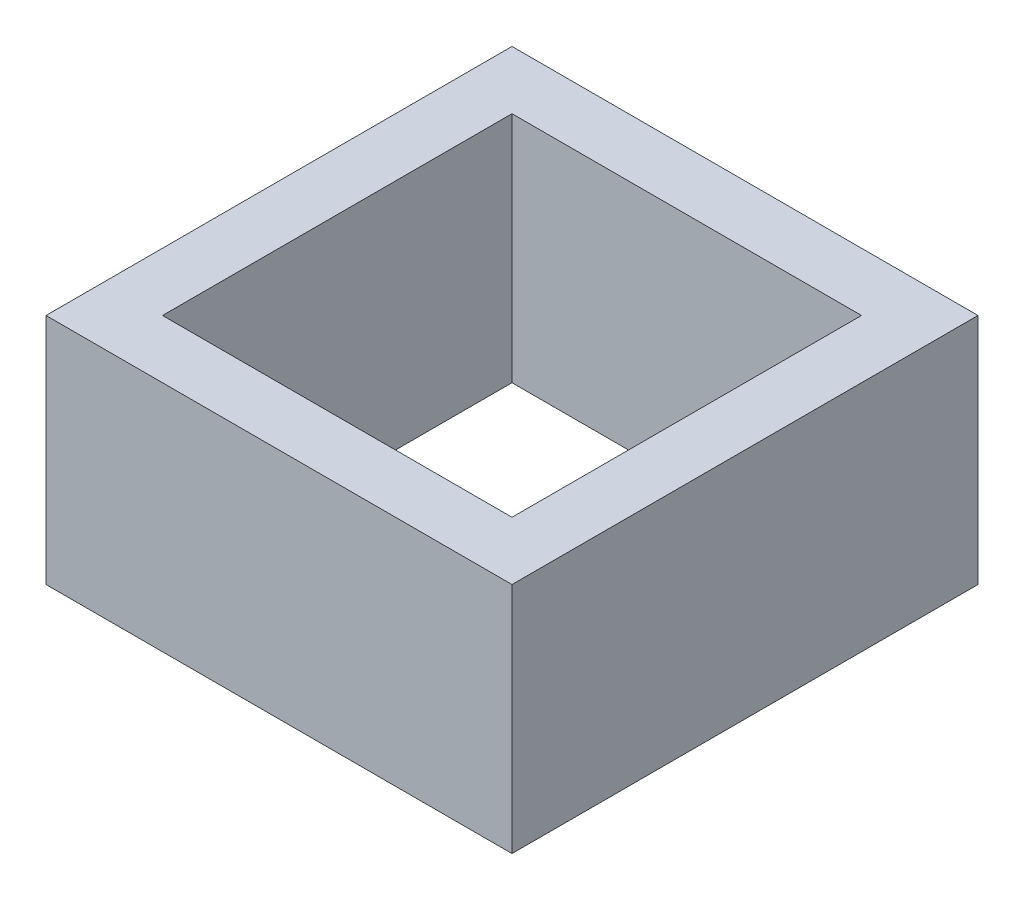
ISO-10303-21;
HEADER;
FILE_DESCRIPTION(('STEP AP214'),'2;1');
FILE_NAME('part.step','',(''),(''),'','','');
FILE_SCHEMA(('AUTOMOTIVE_DESIGN { 1 0 10303 214 1 1 1 1 }'));
ENDSEC;
DATA;
#1=APPLICATION_CONTEXT('core data for automotive mechanical design processes');
#2=APPLICATION_PROTOCOL_DEFINITION('international standard','automotive_design',2000,#1);
#3=PRODUCT_CONTEXT('',#1,'mechanical');
#4=PRODUCT('Part','Part','',(#3));
#5=PRODUCT_RELATED_PRODUCT_CATEGORY('part','',(#4));
#6=PRODUCT_DEFINITION_FORMATION('','',#4);
#7=PRODUCT_DEFINITION_CONTEXT('part definition',#1,'design');
#8=PRODUCT_DEFINITION('design','',#6,#7);
#9=PRODUCT_DEFINITION_SHAPE('','',#8);
#10=(LENGTH_UNIT() NAMED_UNIT(*) SI_UNIT(.MILLI.,.METRE.));
#11=(NAMED_UNIT(*) PLANE_ANGLE_UNIT() SI_UNIT($,.RADIAN.));
#12=(NAMED_UNIT(*) SI_UNIT($,.STERADIAN.) SOLID_ANGLE_UNIT());
#13=UNCERTAINTY_MEASURE_WITH_UNIT(LENGTH_MEASURE(1.E-05),#10,'distance_accuracy_value','');
#14=(GEOMETRIC_REPRESENTATION_CONTEXT(3) GLOBAL_UNCERTAINTY_ASSIGNED_CONTEXT((#13)) GLOBAL_UNIT_ASSIGNED_CONTEXT((#10,
#11,#12)) REPRESENTATION_CONTEXT('',''));
#15=CARTESIAN_POINT('',(0.,0.,0.));
#16=DIRECTION('',(0.,0.,1.));
#17=DIRECTION('',(1.,0.,0.));
#18=AXIS2_PLACEMENT_3D('',#15,#16,#17);
#19=CARTESIAN_POINT('',(0.,12.7,0.));
#20=DIRECTION('',(0.,1.,0.));
#21=DIRECTION('',(0.,0.,1.));
#22=AXIS2_PLACEMENT_3D('',#19,#20,#21);
#23=PLANE('',#22);
#24=DIRECTION('',(0.,0.,-1.));
#25=VECTOR('',#24,1.);
#26=CARTESIAN_POINT('',(12.7,12.7,12.7));
#27=LINE('',#26,#25);
#28=CARTESIAN_POINT('',(12.7,12.7,12.7));
#29=VERTEX_POINT('',#28);
#30=CARTESIAN_POINT('',(12.7,12.7,-12.7));
#31=VERTEX_POINT('',#30);
#32=EDGE_CURVE('E177',#29,#31,#27,.T.);
#33=ORIENTED_EDGE('',*,*,#32,.T.);
#34=DIRECTION('',(-1.,0.,0.));
#35=VECTOR('',#34,1.);
#36=CARTESIAN_POINT('',(-12.7,12.7,-12.7));
#37=LINE('',#36,#35);
#38=CARTESIAN_POINT('',(-12.7,12.7,-12.7));
#39=VERTEX_POINT('',#38);
#40=EDGE_CURVE('E181',#31,#39,#37,.T.);
#41=ORIENTED_EDGE('',*,*,#40,.T.);
#42=DIRECTION('',(0.,0.,1.));
#43=VECTOR('',#42,1.);
#44=CARTESIAN_POINT('',(-12.7,12.7,12.7));
#45=LINE('',#44,#43);
#46=CARTESIAN_POINT('',(-12.7,12.7,12.7));
#47=VERTEX_POINT('',#46);
#48=EDGE_CURVE('E185',#39,#47,#45,.T.);
#49=ORIENTED_EDGE('',*,*,#48,.T.);
#50=DIRECTION('',(1.,0.,0.));
#51=VECTOR('',#50,1.);
#52=CARTESIAN_POINT('',(-12.7,12.7,12.7));
#53=LINE('',#52,#51);
#54=EDGE_CURVE('E188',#47,#29,#53,.T.);
#55=ORIENTED_EDGE('',*,*,#54,.T.);
#56=EDGE_LOOP('',(#33,#41,#49,#55));
#57=FACE_BOUND('',#56,.T.);
#58=DIRECTION('',(-1.,0.,0.));
#59=VECTOR('',#58,1.);
#60=CARTESIAN_POINT('',(0.,12.7,-9.525));
#61=LINE('',#60,#59);
#62=CARTESIAN_POINT('',(9.52500000000001,12.7,-9.525));
#63=VERTEX_POINT('',#62);
#64=CARTESIAN_POINT('',(-9.525,12.7,-9.525));
#65=VERTEX_POINT('',#64);
#66=EDGE_CURVE('E138',#63,#65,#61,.T.);
#67=ORIENTED_EDGE('',*,*,#66,.F.);
#68=DIRECTION('',(0.,0.,-1.));
#69=VECTOR('',#68,1.);
#70=CARTESIAN_POINT('',(9.52500000000001,12.7,0.));
#71=LINE('',#70,#69);
#72=CARTESIAN_POINT('',(9.52500000000001,12.7,9.525));
#73=VERTEX_POINT('',#72);
#74=EDGE_CURVE('E129',#73,#63,#71,.T.);
#75=ORIENTED_EDGE('',*,*,#74,.F.);
#76=DIRECTION('',(1.,0.,0.));
#77=VECTOR('',#76,1.);
#78=CARTESIAN_POINT('',(0.,12.7,9.525));
#79=LINE('',#78,#77);
#80=CARTESIAN_POINT('',(-9.525,12.7,9.525));
#81=VERTEX_POINT('',#80);
#82=EDGE_CURVE('E155',#81,#73,#79,.T.);
#83=ORIENTED_EDGE('',*,*,#82,.F.);
#84=DIRECTION('',(0.,0.,1.));
#85=VECTOR('',#84,1.);
#86=CARTESIAN_POINT('',(-9.525,12.7,0.));
#87=LINE('',#86,#85);
#88=EDGE_CURVE('E151',#65,#81,#87,.T.);
#89=ORIENTED_EDGE('',*,*,#88,.F.);
#90=EDGE_LOOP('',(#67,#75,#83,#89));
#91=FACE_BOUND('',#90,.T.);
#92=ADVANCED_FACE('F63',(#57,#91),#23,.T.);
#93=CARTESIAN_POINT('',(0.,0.,0.));
#94=DIRECTION('',(0.,1.,0.));
#95=DIRECTION('',(0.,0.,1.));
#96=AXIS2_PLACEMENT_3D('',#93,#94,#95);
#97=PLANE('',#96);
#98=DIRECTION('',(0.,0.,-1.));
#99=VECTOR('',#98,1.);
#100=CARTESIAN_POINT('',(12.7,0.,12.7));
#101=LINE('',#100,#99);
#102=CARTESIAN_POINT('',(12.7,0.,12.7));
#103=VERTEX_POINT('',#102);
#104=CARTESIAN_POINT('',(12.7,0.,-12.7));
#105=VERTEX_POINT('',#104);
#106=EDGE_CURVE('E147',#103,#105,#101,.T.);
#107=ORIENTED_EDGE('',*,*,#106,.F.);
#108=DIRECTION('',(1.,0.,0.));
#109=VECTOR('',#108,1.);
#110=CARTESIAN_POINT('',(-12.7,0.,12.7));
#111=LINE('',#110,#109);
#112=CARTESIAN_POINT('',(-12.7,0.,12.7));
#113=VERTEX_POINT('',#112);
#114=EDGE_CURVE('E182',#113,#103,#111,.T.);
#115=ORIENTED_EDGE('',*,*,#114,.F.);
#116=DIRECTION('',(0.,0.,1.));
#117=VECTOR('',#116,1.);
#118=CARTESIAN_POINT('',(-12.7,0.,12.7));
#119=LINE('',#118,#117);
#120=CARTESIAN_POINT('',(-12.7,0.,-12.7));
#121=VERTEX_POINT('',#120);
#122=EDGE_CURVE('E198',#121,#113,#119,.T.);
#123=ORIENTED_EDGE('',*,*,#122,.F.);
#124=DIRECTION('',(-1.,0.,0.));
#125=VECTOR('',#124,1.);
#126=CARTESIAN_POINT('',(-12.7,0.,-12.7));
#127=LINE('',#126,#125);
#128=EDGE_CURVE('E195',#105,#121,#127,.T.);
#129=ORIENTED_EDGE('',*,*,#128,.F.);
#130=EDGE_LOOP('',(#107,#115,#123,#129));
#131=FACE_BOUND('',#130,.T.);
#132=DIRECTION('',(0.,0.,-1.));
#133=VECTOR('',#132,1.);
#134=CARTESIAN_POINT('',(9.52500000000001,0.,0.));
#135=LINE('',#134,#133);
#136=CARTESIAN_POINT('',(9.52500000000001,0.,9.525));
#137=VERTEX_POINT('',#136);
#138=CARTESIAN_POINT('',(9.52500000000001,0.,-9.525));
#139=VERTEX_POINT('',#138);
#140=EDGE_CURVE('E87',#137,#139,#135,.T.);
#141=ORIENTED_EDGE('',*,*,#140,.T.);
#142=DIRECTION('',(-1.,0.,0.));
#143=VECTOR('',#142,1.);
#144=CARTESIAN_POINT('',(0.,0.,-9.525));
#145=LINE('',#144,#143);
#146=CARTESIAN_POINT('',(-9.525,0.,-9.525));
#147=VERTEX_POINT('',#146);
#148=EDGE_CURVE('E145',#139,#147,#145,.T.);
#149=ORIENTED_EDGE('',*,*,#148,.T.);
#150=DIRECTION('',(0.,0.,1.));
#151=VECTOR('',#150,1.);
#152=CARTESIAN_POINT('',(-9.525,0.,0.));
#153=LINE('',#152,#151);
#154=CARTESIAN_POINT('',(-9.525,0.,9.525));
#155=VERTEX_POINT('',#154);
#156=EDGE_CURVE('E164',#147,#155,#153,.T.);
#157=ORIENTED_EDGE('',*,*,#156,.T.);
#158=DIRECTION('',(1.,0.,0.));
#159=VECTOR('',#158,1.);
#160=CARTESIAN_POINT('',(0.,0.,9.525));
#161=LINE('',#160,#159);
#162=EDGE_CURVE('E139',#155,#137,#161,.T.);
#163=ORIENTED_EDGE('',*,*,#162,.T.);
#164=EDGE_LOOP('',(#141,#149,#157,#163));
#165=FACE_BOUND('',#164,.T.);
#166=ADVANCED_FACE('F221',(#131,#165),#97,.F.);
#167=CARTESIAN_POINT('',(12.7,12.7,12.7));
#168=DIRECTION('',(-1.,0.,0.));
#169=DIRECTION('',(0.,0.,1.));
#170=AXIS2_PLACEMENT_3D('',#167,#168,#169);
#171=PLANE('',#170);
#172=ORIENTED_EDGE('',*,*,#106,.T.);
#173=DIRECTION('',(0.,-1.,0.));
#174=VECTOR('',#173,1.);
#175=CARTESIAN_POINT('',(12.7,12.7,-12.7));
#176=LINE('',#175,#174);
#177=EDGE_CURVE('E12',#31,#105,#176,.T.);
#178=ORIENTED_EDGE('',*,*,#177,.F.);
#179=ORIENTED_EDGE('',*,*,#32,.F.);
#180=DIRECTION('',(0.,-1.,0.));
#181=VECTOR('',#180,1.);
#182=CARTESIAN_POINT('',(12.7,12.7,12.7));
#183=LINE('',#182,#181);
#184=EDGE_CURVE('E191',#29,#103,#183,.T.);
#185=ORIENTED_EDGE('',*,*,#184,.T.);
#186=EDGE_LOOP('',(#172,#178,#179,#185));
#187=FACE_BOUND('',#186,.T.);
#188=ADVANCED_FACE('F65',(#187),#171,.F.);
#189=CARTESIAN_POINT('',(-12.7,12.7,-12.7));
#190=DIRECTION('',(0.,0.,1.));
#191=DIRECTION('',(1.,0.,0.));
#192=AXIS2_PLACEMENT_3D('',#189,#190,#191);
#193=PLANE('',#192);
#194=ORIENTED_EDGE('',*,*,#128,.T.);
#195=DIRECTION('',(0.,-1.,0.));
#196=VECTOR('',#195,1.);
#197=CARTESIAN_POINT('',(-12.7,12.7,-12.7));
#198=LINE('',#197,#196);
#199=EDGE_CURVE('E72',#39,#121,#198,.T.);
#200=ORIENTED_EDGE('',*,*,#199,.F.);
#201=ORIENTED_EDGE('',*,*,#40,.F.);
#202=ORIENTED_EDGE('',*,*,#177,.T.);
#203=EDGE_LOOP('',(#194,#200,#201,#202));
#204=FACE_BOUND('',#203,.T.);
#205=ADVANCED_FACE('F231',(#204),#193,.F.);
#206=CARTESIAN_POINT('',(-12.7,12.7,12.7));
#207=DIRECTION('',(1.,0.,0.));
#208=DIRECTION('',(0.,0.,-1.));
#209=AXIS2_PLACEMENT_3D('',#206,#207,#208);
#210=PLANE('',#209);
#211=ORIENTED_EDGE('',*,*,#122,.T.);
#212=DIRECTION('',(0.,-1.,0.));
#213=VECTOR('',#212,1.);
#214=CARTESIAN_POINT('',(-12.7,12.7,12.7));
#215=LINE('',#214,#213);
#216=EDGE_CURVE('E206',#47,#113,#215,.T.);
#217=ORIENTED_EDGE('',*,*,#216,.F.);
#218=ORIENTED_EDGE('',*,*,#48,.F.);
#219=ORIENTED_EDGE('',*,*,#199,.T.);
#220=EDGE_LOOP('',(#211,#217,#218,#219));
#221=FACE_BOUND('',#220,.T.);
#222=ADVANCED_FACE('F215',(#221),#210,.F.);
#223=CARTESIAN_POINT('',(-12.7,12.7,12.7));
#224=DIRECTION('',(0.,0.,-1.));
#225=DIRECTION('',(-1.,0.,0.));
#226=AXIS2_PLACEMENT_3D('',#223,#224,#225);
#227=PLANE('',#226);
#228=ORIENTED_EDGE('',*,*,#114,.T.);
#229=ORIENTED_EDGE('',*,*,#184,.F.);
#230=ORIENTED_EDGE('',*,*,#54,.F.);
#231=ORIENTED_EDGE('',*,*,#216,.T.);
#232=EDGE_LOOP('',(#228,#229,#230,#231));
#233=FACE_BOUND('',#232,.T.);
#234=ADVANCED_FACE('F225',(#233),#227,.F.);
#235=CARTESIAN_POINT('',(9.52500000000001,12.7,0.));
#236=DIRECTION('',(-1.,0.,0.));
#237=DIRECTION('',(0.,0.,1.));
#238=AXIS2_PLACEMENT_3D('',#235,#236,#237);
#239=PLANE('',#238);
#240=ORIENTED_EDGE('',*,*,#140,.F.);
#241=DIRECTION('',(0.,-1.,0.));
#242=VECTOR('',#241,1.);
#243=CARTESIAN_POINT('',(9.52500000000001,12.7,9.525));
#244=LINE('',#243,#242);
#245=EDGE_CURVE('E133',#73,#137,#244,.T.);
#246=ORIENTED_EDGE('',*,*,#245,.F.);
#247=ORIENTED_EDGE('',*,*,#74,.T.);
#248=DIRECTION('',(0.,-1.,0.));
#249=VECTOR('',#248,1.);
#250=CARTESIAN_POINT('',(9.52500000000001,12.7,-9.525));
#251=LINE('',#250,#249);
#252=EDGE_CURVE('E132',#63,#139,#251,.T.);
#253=ORIENTED_EDGE('',*,*,#252,.T.);
#254=EDGE_LOOP('',(#240,#246,#247,#253));
#255=FACE_BOUND('',#254,.T.);
#256=ADVANCED_FACE('F131',(#255),#239,.T.);
#257=CARTESIAN_POINT('',(0.,12.7,-9.525));
#258=DIRECTION('',(0.,0.,1.));
#259=DIRECTION('',(1.,0.,0.));
#260=AXIS2_PLACEMENT_3D('',#257,#258,#259);
#261=PLANE('',#260);
#262=ORIENTED_EDGE('',*,*,#148,.F.);
#263=ORIENTED_EDGE('',*,*,#252,.F.);
#264=ORIENTED_EDGE('',*,*,#66,.T.);
#265=DIRECTION('',(0.,-1.,0.));
#266=VECTOR('',#265,1.);
#267=CARTESIAN_POINT('',(-9.525,12.7,-9.525));
#268=LINE('',#267,#266);
#269=EDGE_CURVE('E148',#65,#147,#268,.T.);
#270=ORIENTED_EDGE('',*,*,#269,.T.);
#271=EDGE_LOOP('',(#262,#263,#264,#270));
#272=FACE_BOUND('',#271,.T.);
#273=ADVANCED_FACE('F142',(#272),#261,.T.);
#274=CARTESIAN_POINT('',(-9.525,12.7,0.));
#275=DIRECTION('',(1.,0.,0.));
#276=DIRECTION('',(0.,0.,-1.));
#277=AXIS2_PLACEMENT_3D('',#274,#275,#276);
#278=PLANE('',#277);
#279=ORIENTED_EDGE('',*,*,#156,.F.);
#280=ORIENTED_EDGE('',*,*,#269,.F.);
#281=ORIENTED_EDGE('',*,*,#88,.T.);
#282=DIRECTION('',(0.,-1.,0.));
#283=VECTOR('',#282,1.);
#284=CARTESIAN_POINT('',(-9.525,12.7,9.525));
#285=LINE('',#284,#283);
#286=EDGE_CURVE('E79',#81,#155,#285,.T.);
#287=ORIENTED_EDGE('',*,*,#286,.T.);
#288=EDGE_LOOP('',(#279,#280,#281,#287));
#289=FACE_BOUND('',#288,.T.);
#290=ADVANCED_FACE('F254',(#289),#278,.T.);
#291=CARTESIAN_POINT('',(0.,12.7,9.525));
#292=DIRECTION('',(0.,0.,-1.));
#293=DIRECTION('',(-1.,0.,0.));
#294=AXIS2_PLACEMENT_3D('',#291,#292,#293);
#295=PLANE('',#294);
#296=ORIENTED_EDGE('',*,*,#162,.F.);
#297=ORIENTED_EDGE('',*,*,#286,.F.);
#298=ORIENTED_EDGE('',*,*,#82,.T.);
#299=ORIENTED_EDGE('',*,*,#245,.T.);
#300=EDGE_LOOP('',(#296,#297,#298,#299));
#301=FACE_BOUND('',#300,.T.);
#302=ADVANCED_FACE('F258',(#301),#295,.T.);
#303=CLOSED_SHELL('',(#92,#166,#188,#205,#222,#234,#256,#273,#290,#302));
#304=MANIFOLD_SOLID_BREP('B2',#303);
#305=ADVANCED_BREP_SHAPE_REPRESENTATION('',(#18,#304),#14);
#306=SHAPE_DEFINITION_REPRESENTATION(#9,#305);
ENDSEC;
END-ISO-10303-21;
